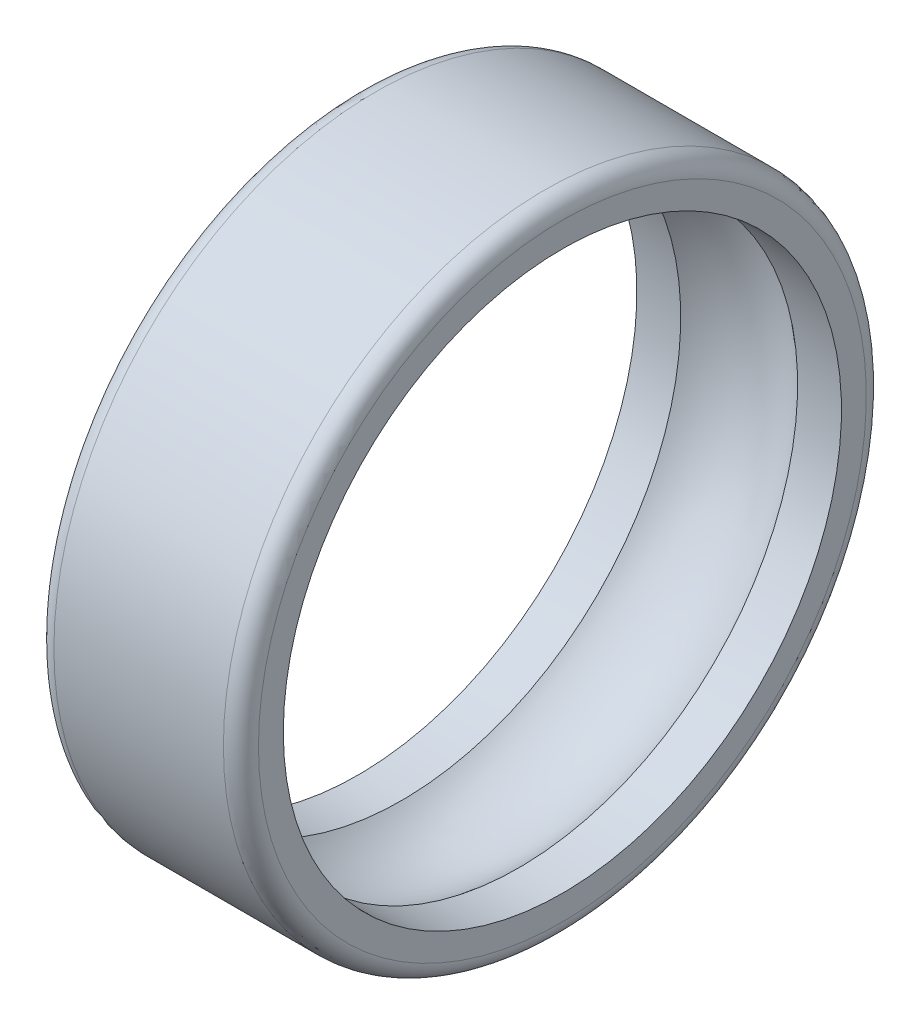
ISO-10303-21;
HEADER;
FILE_DESCRIPTION(('STEP AP214'),'2;1');
FILE_NAME('part.step','',(''),(''),'','','');
FILE_SCHEMA(('AUTOMOTIVE_DESIGN { 1 0 10303 214 1 1 1 1 }'));
ENDSEC;
DATA;
#1=APPLICATION_CONTEXT('core data for automotive mechanical design processes');
#2=APPLICATION_PROTOCOL_DEFINITION('international standard','automotive_design',2000,#1);
#3=PRODUCT_CONTEXT('',#1,'mechanical');
#4=PRODUCT('Part','Part','',(#3));
#5=PRODUCT_RELATED_PRODUCT_CATEGORY('part','',(#4));
#6=PRODUCT_DEFINITION_FORMATION('','',#4);
#7=PRODUCT_DEFINITION_CONTEXT('part definition',#1,'design');
#8=PRODUCT_DEFINITION('design','',#6,#7);
#9=PRODUCT_DEFINITION_SHAPE('','',#8);
#10=(LENGTH_UNIT() NAMED_UNIT(*) SI_UNIT(.MILLI.,.METRE.));
#11=(NAMED_UNIT(*) PLANE_ANGLE_UNIT() SI_UNIT($,.RADIAN.));
#12=(NAMED_UNIT(*) SI_UNIT($,.STERADIAN.) SOLID_ANGLE_UNIT());
#13=UNCERTAINTY_MEASURE_WITH_UNIT(LENGTH_MEASURE(1.E-05),#10,'distance_accuracy_value','');
#14=(GEOMETRIC_REPRESENTATION_CONTEXT(3) GLOBAL_UNCERTAINTY_ASSIGNED_CONTEXT((#13)) GLOBAL_UNIT_ASSIGNED_CONTEXT((#10,
#11,#12)) REPRESENTATION_CONTEXT('',''));
#15=CARTESIAN_POINT('',(0.,0.,0.));
#16=DIRECTION('',(0.,0.,1.));
#17=DIRECTION('',(1.,0.,0.));
#18=AXIS2_PLACEMENT_3D('',#15,#16,#17);
#19=CARTESIAN_POINT('',(-13.5510896882854,0.,0.));
#20=DIRECTION('',(-1.,0.,0.));
#21=DIRECTION('',(0.,0.,1.));
#22=AXIS2_PLACEMENT_3D('',#19,#20,#21);
#23=CYLINDRICAL_SURFACE('',#22,9.55);
#24=CARTESIAN_POINT('',(3.5,0.,0.));
#25=DIRECTION('',(-1.,0.,0.));
#26=DIRECTION('',(0.,0.,1.));
#27=AXIS2_PLACEMENT_3D('',#24,#25,#26);
#28=CIRCLE('',#27,9.55);
#29=CARTESIAN_POINT('',(3.5,0.,9.55));
#30=VERTEX_POINT('',#29);
#31=EDGE_CURVE('E66',#30,#30,#28,.T.);
#32=ORIENTED_EDGE('',*,*,#31,.F.);
#33=EDGE_LOOP('',(#32));
#34=FACE_BOUND('',#33,.T.);
#35=CARTESIAN_POINT('',(2.,0.,0.));
#36=DIRECTION('',(-1.,0.,0.));
#37=DIRECTION('',(0.,0.,1.));
#38=AXIS2_PLACEMENT_3D('',#35,#36,#37);
#39=CIRCLE('',#38,9.55);
#40=CARTESIAN_POINT('',(2.,0.,9.55));
#41=VERTEX_POINT('',#40);
#42=EDGE_CURVE('E57',#41,#41,#39,.T.);
#43=ORIENTED_EDGE('',*,*,#42,.T.);
#44=EDGE_LOOP('',(#43));
#45=FACE_BOUND('',#44,.T.);
#46=ADVANCED_FACE('F37',(#34,#45),#23,.F.);
#47=CARTESIAN_POINT('',(0.,0.,0.));
#48=DIRECTION('',(-1.,0.,0.));
#49=DIRECTION('',(0.,0.,1.));
#50=AXIS2_PLACEMENT_3D('',#47,#48,#49);
#51=TOROIDAL_SURFACE('',#50,7.31393202250021,3.);
#52=ORIENTED_EDGE('',*,*,#42,.F.);
#53=EDGE_LOOP('',(#52));
#54=FACE_BOUND('',#53,.T.);
#55=CARTESIAN_POINT('',(-2.,0.,0.));
#56=DIRECTION('',(-1.,0.,0.));
#57=DIRECTION('',(0.,0.,1.));
#58=AXIS2_PLACEMENT_3D('',#55,#56,#57);
#59=CIRCLE('',#58,9.55);
#60=CARTESIAN_POINT('',(-2.,0.,9.55));
#61=VERTEX_POINT('',#60);
#62=EDGE_CURVE('E60',#61,#61,#59,.T.);
#63=ORIENTED_EDGE('',*,*,#62,.T.);
#64=EDGE_LOOP('',(#63));
#65=FACE_BOUND('',#64,.T.);
#66=ADVANCED_FACE('F74',(#54,#65),#51,.F.);
#67=CARTESIAN_POINT('',(-13.5510896882854,0.,0.));
#68=DIRECTION('',(-1.,0.,0.));
#69=DIRECTION('',(0.,0.,1.));
#70=AXIS2_PLACEMENT_3D('',#67,#68,#69);
#71=CYLINDRICAL_SURFACE('',#70,9.55);
#72=ORIENTED_EDGE('',*,*,#62,.F.);
#73=EDGE_LOOP('',(#72));
#74=FACE_BOUND('',#73,.T.);
#75=CARTESIAN_POINT('',(-3.5,0.,0.));
#76=DIRECTION('',(-1.,0.,0.));
#77=DIRECTION('',(0.,0.,1.));
#78=AXIS2_PLACEMENT_3D('',#75,#76,#77);
#79=CIRCLE('',#78,9.55);
#80=CARTESIAN_POINT('',(-3.5,0.,9.55));
#81=VERTEX_POINT('',#80);
#82=EDGE_CURVE('E63',#81,#81,#79,.T.);
#83=ORIENTED_EDGE('',*,*,#82,.T.);
#84=EDGE_LOOP('',(#83));
#85=FACE_BOUND('',#84,.T.);
#86=ADVANCED_FACE('F80',(#74,#85),#71,.F.);
#87=CARTESIAN_POINT('',(-3.5,11.,0.));
#88=DIRECTION('',(1.,0.,0.));
#89=DIRECTION('',(0.,0.,-1.));
#90=AXIS2_PLACEMENT_3D('',#87,#88,#89);
#91=PLANE('',#90);
#92=CARTESIAN_POINT('',(-3.5,0.,0.));
#93=DIRECTION('',(1.,0.,0.));
#94=DIRECTION('',(0.,0.,-1.));
#95=AXIS2_PLACEMENT_3D('',#92,#93,#94);
#96=CIRCLE('',#95,10.4);
#97=CARTESIAN_POINT('',(-3.5,0.,-10.4));
#98=VERTEX_POINT('',#97);
#99=EDGE_CURVE('E52',#98,#98,#96,.F.);
#100=ORIENTED_EDGE('',*,*,#99,.T.);
#101=EDGE_LOOP('',(#100));
#102=FACE_BOUND('',#101,.T.);
#103=ORIENTED_EDGE('',*,*,#82,.F.);
#104=EDGE_LOOP('',(#103));
#105=FACE_BOUND('',#104,.T.);
#106=ADVANCED_FACE('F86',(#102,#105),#91,.F.);
#107=CARTESIAN_POINT('',(-13.5510896882854,0.,0.));
#108=DIRECTION('',(-1.,0.,0.));
#109=DIRECTION('',(0.,0.,1.));
#110=AXIS2_PLACEMENT_3D('',#107,#108,#109);
#111=CYLINDRICAL_SURFACE('',#110,11.);
#112=CARTESIAN_POINT('',(-2.9,0.,0.));
#113=DIRECTION('',(1.,0.,0.));
#114=DIRECTION('',(0.,0.,-1.));
#115=AXIS2_PLACEMENT_3D('',#112,#113,#114);
#116=CIRCLE('',#115,11.);
#117=CARTESIAN_POINT('',(-2.9,0.,-11.));
#118=VERTEX_POINT('',#117);
#119=EDGE_CURVE('E44',#118,#118,#116,.T.);
#120=ORIENTED_EDGE('',*,*,#119,.T.);
#121=EDGE_LOOP('',(#120));
#122=FACE_BOUND('',#121,.T.);
#123=CARTESIAN_POINT('',(2.9,0.,0.));
#124=DIRECTION('',(-1.,0.,0.));
#125=DIRECTION('',(0.,0.,1.));
#126=AXIS2_PLACEMENT_3D('',#123,#124,#125);
#127=CIRCLE('',#126,11.);
#128=CARTESIAN_POINT('',(2.9,0.,11.));
#129=VERTEX_POINT('',#128);
#130=EDGE_CURVE('E48',#129,#129,#127,.T.);
#131=ORIENTED_EDGE('',*,*,#130,.T.);
#132=EDGE_LOOP('',(#131));
#133=FACE_BOUND('',#132,.T.);
#134=ADVANCED_FACE('F91',(#122,#133),#111,.T.);
#135=CARTESIAN_POINT('',(3.5,11.,0.));
#136=DIRECTION('',(-1.,0.,0.));
#137=DIRECTION('',(0.,0.,1.));
#138=AXIS2_PLACEMENT_3D('',#135,#136,#137);
#139=PLANE('',#138);
#140=CARTESIAN_POINT('',(3.5,0.,0.));
#141=DIRECTION('',(-1.,0.,0.));
#142=DIRECTION('',(0.,0.,1.));
#143=AXIS2_PLACEMENT_3D('',#140,#141,#142);
#144=CIRCLE('',#143,10.4);
#145=CARTESIAN_POINT('',(3.5,0.,10.4));
#146=VERTEX_POINT('',#145);
#147=EDGE_CURVE('E10',#146,#146,#144,.F.);
#148=ORIENTED_EDGE('',*,*,#147,.T.);
#149=EDGE_LOOP('',(#148));
#150=FACE_BOUND('',#149,.T.);
#151=ORIENTED_EDGE('',*,*,#31,.T.);
#152=EDGE_LOOP('',(#151));
#153=FACE_BOUND('',#152,.T.);
#154=ADVANCED_FACE('F70',(#150,#153),#139,.F.);
#155=CARTESIAN_POINT('',(-2.9,0.,0.));
#156=DIRECTION('',(1.,0.,0.));
#157=DIRECTION('',(0.,0.,-1.));
#158=AXIS2_PLACEMENT_3D('',#155,#156,#157);
#159=TOROIDAL_SURFACE('',#158,10.4,0.6);
#160=ORIENTED_EDGE('',*,*,#119,.F.);
#161=EDGE_LOOP('',(#160));
#162=FACE_BOUND('',#161,.T.);
#163=ORIENTED_EDGE('',*,*,#99,.F.);
#164=EDGE_LOOP('',(#163));
#165=FACE_BOUND('',#164,.T.);
#166=ADVANCED_FACE('F100',(#162,#165),#159,.T.);
#167=CARTESIAN_POINT('',(2.9,0.,0.));
#168=DIRECTION('',(-1.,0.,0.));
#169=DIRECTION('',(0.,0.,1.));
#170=AXIS2_PLACEMENT_3D('',#167,#168,#169);
#171=TOROIDAL_SURFACE('',#170,10.4,0.6);
#172=ORIENTED_EDGE('',*,*,#147,.F.);
#173=EDGE_LOOP('',(#172));
#174=FACE_BOUND('',#173,.T.);
#175=ORIENTED_EDGE('',*,*,#130,.F.);
#176=EDGE_LOOP('',(#175));
#177=FACE_BOUND('',#176,.T.);
#178=ADVANCED_FACE('F39',(#174,#177),#171,.T.);
#179=CLOSED_SHELL('',(#46,#66,#86,#106,#134,#154,#166,#178));
#180=MANIFOLD_SOLID_BREP('B2',#179);
#181=ADVANCED_BREP_SHAPE_REPRESENTATION('',(#18,#180),#14);
#182=SHAPE_DEFINITION_REPRESENTATION(#9,#181);
ENDSEC;
END-ISO-10303-21;
